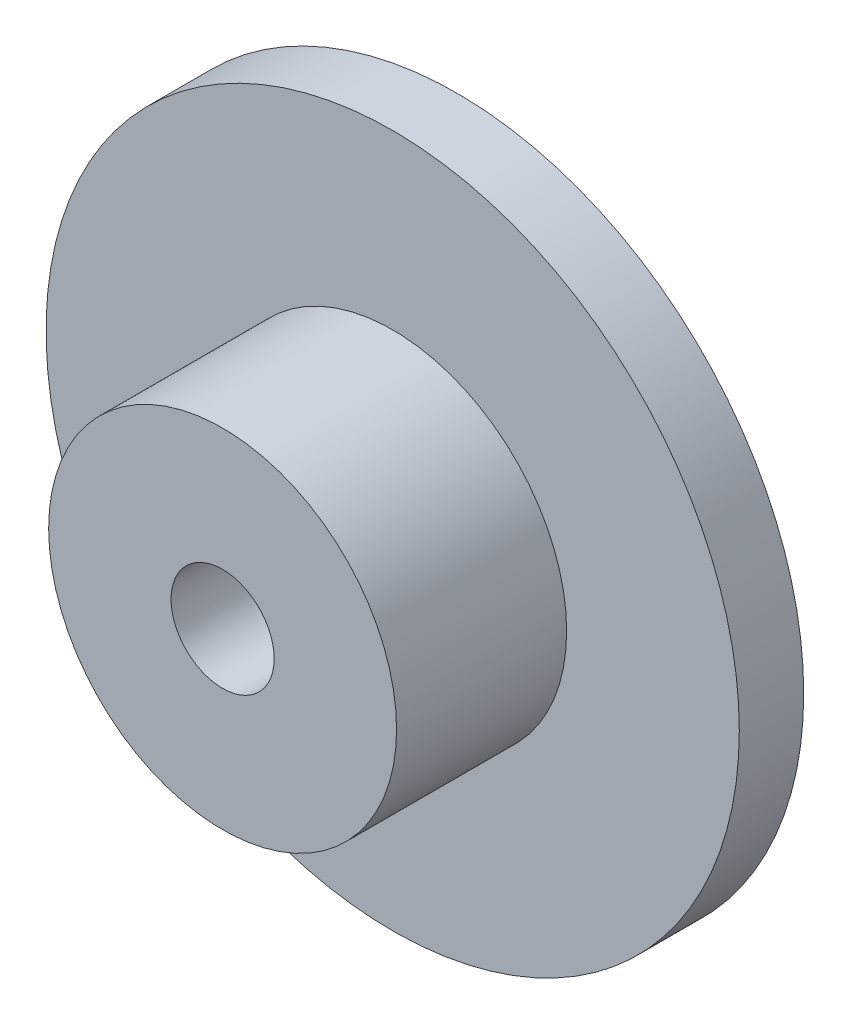
ISO-10303-21;
HEADER;
FILE_DESCRIPTION(('STEP AP214'),'2;1');
FILE_NAME('part.step','',(''),(''),'','','');
FILE_SCHEMA(('AUTOMOTIVE_DESIGN { 1 0 10303 214 1 1 1 1 }'));
ENDSEC;
DATA;
#1=APPLICATION_CONTEXT('core data for automotive mechanical design processes');
#2=APPLICATION_PROTOCOL_DEFINITION('international standard','automotive_design',2000,#1);
#3=PRODUCT_CONTEXT('',#1,'mechanical');
#4=PRODUCT('Part','Part','',(#3));
#5=PRODUCT_RELATED_PRODUCT_CATEGORY('part','',(#4));
#6=PRODUCT_DEFINITION_FORMATION('','',#4);
#7=PRODUCT_DEFINITION_CONTEXT('part definition',#1,'design');
#8=PRODUCT_DEFINITION('design','',#6,#7);
#9=PRODUCT_DEFINITION_SHAPE('','',#8);
#10=(LENGTH_UNIT() NAMED_UNIT(*) SI_UNIT(.MILLI.,.METRE.));
#11=(NAMED_UNIT(*) PLANE_ANGLE_UNIT() SI_UNIT($,.RADIAN.));
#12=(NAMED_UNIT(*) SI_UNIT($,.STERADIAN.) SOLID_ANGLE_UNIT());
#13=UNCERTAINTY_MEASURE_WITH_UNIT(LENGTH_MEASURE(1.E-05),#10,'distance_accuracy_value','');
#14=(GEOMETRIC_REPRESENTATION_CONTEXT(3) GLOBAL_UNCERTAINTY_ASSIGNED_CONTEXT((#13)) GLOBAL_UNIT_ASSIGNED_CONTEXT((#10,
#11,#12)) REPRESENTATION_CONTEXT('',''));
#15=CARTESIAN_POINT('',(0.,0.,0.));
#16=DIRECTION('',(0.,0.,1.));
#17=DIRECTION('',(1.,0.,0.));
#18=AXIS2_PLACEMENT_3D('',#15,#16,#17);
#19=CARTESIAN_POINT('',(0.,0.,1.25));
#20=DIRECTION('',(0.,0.,1.));
#21=DIRECTION('',(1.,0.,0.));
#22=AXIS2_PLACEMENT_3D('',#19,#20,#21);
#23=PLANE('',#22);
#24=CARTESIAN_POINT('',(0.,0.,1.25));
#25=DIRECTION('',(0.,0.,1.));
#26=DIRECTION('',(1.,0.,0.));
#27=AXIS2_PLACEMENT_3D('',#24,#25,#26);
#28=CIRCLE('',#27,6.725);
#29=CARTESIAN_POINT('',(6.725,0.,1.25));
#30=VERTEX_POINT('',#29);
#31=EDGE_CURVE('E10',#30,#30,#28,.T.);
#32=ORIENTED_EDGE('',*,*,#31,.T.);
#33=EDGE_LOOP('',(#32));
#34=FACE_BOUND('',#33,.T.);
#35=CARTESIAN_POINT('',(0.,0.,1.25));
#36=DIRECTION('',(0.,0.,1.));
#37=DIRECTION('',(1.,0.,0.));
#38=AXIS2_PLACEMENT_3D('',#35,#36,#37);
#39=CIRCLE('',#38,3.375);
#40=CARTESIAN_POINT('',(3.375,0.,1.25));
#41=VERTEX_POINT('',#40);
#42=EDGE_CURVE('E55',#41,#41,#39,.T.);
#43=ORIENTED_EDGE('',*,*,#42,.F.);
#44=EDGE_LOOP('',(#43));
#45=FACE_BOUND('',#44,.T.);
#46=ADVANCED_FACE('F39',(#34,#45),#23,.T.);
#47=CARTESIAN_POINT('',(0.,0.,0.));
#48=DIRECTION('',(0.,0.,1.));
#49=DIRECTION('',(1.,0.,0.));
#50=AXIS2_PLACEMENT_3D('',#47,#48,#49);
#51=PLANE('',#50);
#52=CARTESIAN_POINT('',(0.,0.,0.));
#53=DIRECTION('',(0.,0.,1.));
#54=DIRECTION('',(1.,0.,0.));
#55=AXIS2_PLACEMENT_3D('',#52,#53,#54);
#56=CIRCLE('',#55,6.725);
#57=CARTESIAN_POINT('',(6.725,0.,0.));
#58=VERTEX_POINT('',#57);
#59=EDGE_CURVE('E43',#58,#58,#56,.T.);
#60=ORIENTED_EDGE('',*,*,#59,.F.);
#61=EDGE_LOOP('',(#60));
#62=FACE_BOUND('',#61,.T.);
#63=CARTESIAN_POINT('',(0.,0.,0.));
#64=DIRECTION('',(0.,0.,1.));
#65=DIRECTION('',(1.,0.,0.));
#66=AXIS2_PLACEMENT_3D('',#63,#64,#65);
#67=CIRCLE('',#66,1.);
#68=CARTESIAN_POINT('',(1.,0.,0.));
#69=VERTEX_POINT('',#68);
#70=EDGE_CURVE('E50',#69,#69,#67,.T.);
#71=ORIENTED_EDGE('',*,*,#70,.T.);
#72=EDGE_LOOP('',(#71));
#73=FACE_BOUND('',#72,.T.);
#74=ADVANCED_FACE('F80',(#62,#73),#51,.F.);
#75=CARTESIAN_POINT('',(0.,0.,1.25));
#76=DIRECTION('',(0.,0.,-1.));
#77=DIRECTION('',(-1.,0.,0.));
#78=AXIS2_PLACEMENT_3D('',#75,#76,#77);
#79=CYLINDRICAL_SURFACE('',#78,6.725);
#80=ORIENTED_EDGE('',*,*,#31,.F.);
#81=EDGE_LOOP('',(#80));
#82=FACE_BOUND('',#81,.T.);
#83=ORIENTED_EDGE('',*,*,#59,.T.);
#84=EDGE_LOOP('',(#83));
#85=FACE_BOUND('',#84,.T.);
#86=ADVANCED_FACE('F41',(#82,#85),#79,.T.);
#87=CARTESIAN_POINT('',(0.,0.,1.25));
#88=DIRECTION('',(0.,0.,-1.));
#89=DIRECTION('',(-1.,0.,0.));
#90=AXIS2_PLACEMENT_3D('',#87,#88,#89);
#91=CYLINDRICAL_SURFACE('',#90,1.);
#92=ORIENTED_EDGE('',*,*,#70,.F.);
#93=EDGE_LOOP('',(#92));
#94=FACE_BOUND('',#93,.T.);
#95=CARTESIAN_POINT('',(0.,0.,4.55));
#96=DIRECTION('',(0.,0.,1.));
#97=DIRECTION('',(1.,0.,0.));
#98=AXIS2_PLACEMENT_3D('',#95,#96,#97);
#99=CIRCLE('',#98,1.);
#100=CARTESIAN_POINT('',(1.,0.,4.55));
#101=VERTEX_POINT('',#100);
#102=EDGE_CURVE('E58',#101,#101,#99,.T.);
#103=ORIENTED_EDGE('',*,*,#102,.T.);
#104=EDGE_LOOP('',(#103));
#105=FACE_BOUND('',#104,.T.);
#106=ADVANCED_FACE('F64',(#94,#105),#91,.F.);
#107=CARTESIAN_POINT('',(0.,0.,4.55));
#108=DIRECTION('',(0.,0.,1.));
#109=DIRECTION('',(1.,0.,0.));
#110=AXIS2_PLACEMENT_3D('',#107,#108,#109);
#111=PLANE('',#110);
#112=CARTESIAN_POINT('',(0.,0.,4.55));
#113=DIRECTION('',(0.,0.,1.));
#114=DIRECTION('',(1.,0.,0.));
#115=AXIS2_PLACEMENT_3D('',#112,#113,#114);
#116=CIRCLE('',#115,3.375);
#117=CARTESIAN_POINT('',(3.375,0.,4.55));
#118=VERTEX_POINT('',#117);
#119=EDGE_CURVE('E54',#118,#118,#116,.T.);
#120=ORIENTED_EDGE('',*,*,#119,.T.);
#121=EDGE_LOOP('',(#120));
#122=FACE_BOUND('',#121,.T.);
#123=ORIENTED_EDGE('',*,*,#102,.F.);
#124=EDGE_LOOP('',(#123));
#125=FACE_BOUND('',#124,.T.);
#126=ADVANCED_FACE('F66',(#122,#125),#111,.T.);
#127=CARTESIAN_POINT('',(0.,0.,4.55));
#128=DIRECTION('',(0.,0.,-1.));
#129=DIRECTION('',(-1.,0.,0.));
#130=AXIS2_PLACEMENT_3D('',#127,#128,#129);
#131=CYLINDRICAL_SURFACE('',#130,3.375);
#132=ORIENTED_EDGE('',*,*,#119,.F.);
#133=EDGE_LOOP('',(#132));
#134=FACE_BOUND('',#133,.T.);
#135=ORIENTED_EDGE('',*,*,#42,.T.);
#136=EDGE_LOOP('',(#135));
#137=FACE_BOUND('',#136,.T.);
#138=ADVANCED_FACE('F68',(#134,#137),#131,.T.);
#139=CLOSED_SHELL('',(#46,#74,#86,#106,#126,#138));
#140=MANIFOLD_SOLID_BREP('B2',#139);
#141=ADVANCED_BREP_SHAPE_REPRESENTATION('',(#18,#140),#14);
#142=SHAPE_DEFINITION_REPRESENTATION(#9,#141);
ENDSEC;
END-ISO-10303-21;
